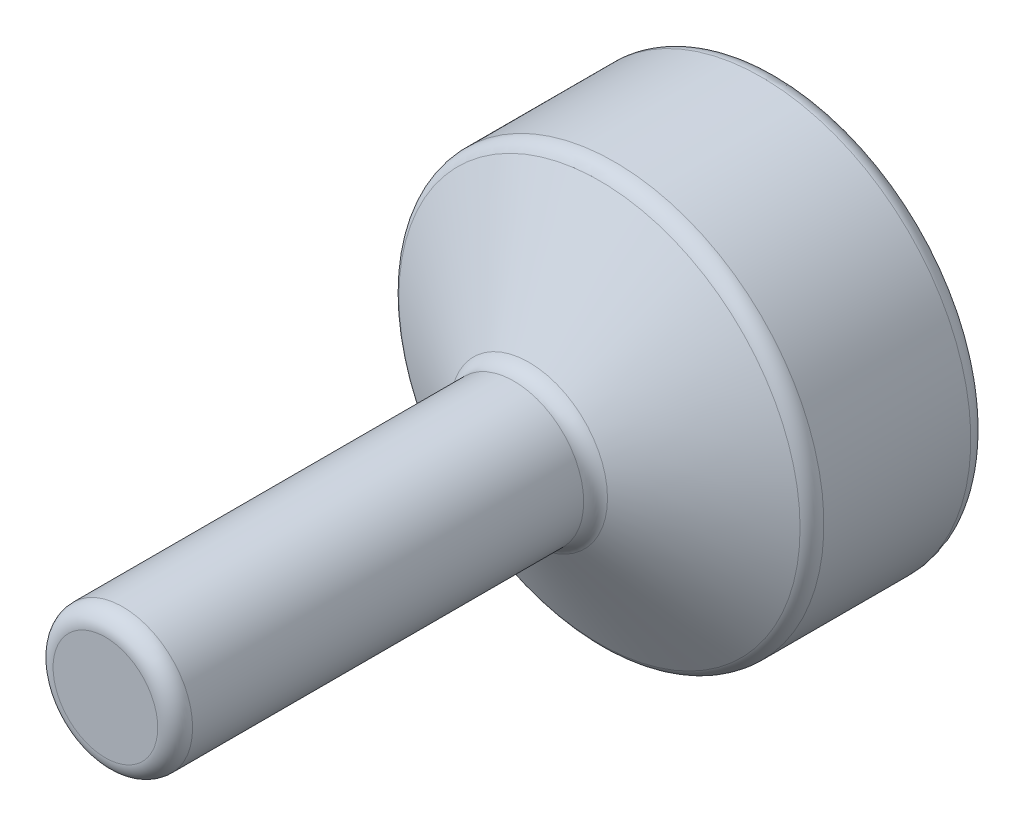
ISO-10303-21;
HEADER;
FILE_DESCRIPTION(('STEP AP214'),'2;1');
FILE_NAME('part.step','',(''),(''),'','','');
FILE_SCHEMA(('AUTOMOTIVE_DESIGN { 1 0 10303 214 1 1 1 1 }'));
ENDSEC;
DATA;
#1=APPLICATION_CONTEXT('core data for automotive mechanical design processes');
#2=APPLICATION_PROTOCOL_DEFINITION('international standard','automotive_design',2000,#1);
#3=PRODUCT_CONTEXT('',#1,'mechanical');
#4=PRODUCT('Part','Part','',(#3));
#5=PRODUCT_RELATED_PRODUCT_CATEGORY('part','',(#4));
#6=PRODUCT_DEFINITION_FORMATION('','',#4);
#7=PRODUCT_DEFINITION_CONTEXT('part definition',#1,'design');
#8=PRODUCT_DEFINITION('design','',#6,#7);
#9=PRODUCT_DEFINITION_SHAPE('','',#8);
#10=(LENGTH_UNIT() NAMED_UNIT(*) SI_UNIT(.MILLI.,.METRE.));
#11=(NAMED_UNIT(*) PLANE_ANGLE_UNIT() SI_UNIT($,.RADIAN.));
#12=(NAMED_UNIT(*) SI_UNIT($,.STERADIAN.) SOLID_ANGLE_UNIT());
#13=UNCERTAINTY_MEASURE_WITH_UNIT(LENGTH_MEASURE(1.E-05),#10,'distance_accuracy_value','');
#14=(GEOMETRIC_REPRESENTATION_CONTEXT(3) GLOBAL_UNCERTAINTY_ASSIGNED_CONTEXT((#13)) GLOBAL_UNIT_ASSIGNED_CONTEXT((#10,
#11,#12)) REPRESENTATION_CONTEXT('',''));
#15=CARTESIAN_POINT('',(0.,0.,0.));
#16=DIRECTION('',(0.,0.,1.));
#17=DIRECTION('',(1.,0.,0.));
#18=AXIS2_PLACEMENT_3D('',#15,#16,#17);
#19=CARTESIAN_POINT('',(0.,0.,0.));
#20=DIRECTION('',(0.,0.,-1.));
#21=DIRECTION('',(-1.,0.,0.));
#22=AXIS2_PLACEMENT_3D('',#19,#20,#21);
#23=PLANE('',#22);
#24=CARTESIAN_POINT('',(0.,0.,0.));
#25=DIRECTION('',(0.,0.,-1.));
#26=DIRECTION('',(-1.,0.,0.));
#27=AXIS2_PLACEMENT_3D('',#24,#25,#26);
#28=CIRCLE('',#27,2.794);
#29=CARTESIAN_POINT('',(-2.794,0.,0.));
#30=VERTEX_POINT('',#29);
#31=EDGE_CURVE('E10',#30,#30,#28,.T.);
#32=ORIENTED_EDGE('',*,*,#31,.T.);
#33=EDGE_LOOP('',(#32));
#34=FACE_BOUND('',#33,.T.);
#35=ADVANCED_FACE('F31',(#34),#23,.T.);
#36=CARTESIAN_POINT('',(0.,0.,9.80917574699331));
#37=DIRECTION('',(0.,0.,1.));
#38=DIRECTION('',(1.,0.,0.));
#39=AXIS2_PLACEMENT_3D('',#36,#37,#38);
#40=CYLINDRICAL_SURFACE('',#39,3.048);
#41=CARTESIAN_POINT('',(0.,0.,2.39335303162583));
#42=DIRECTION('',(0.,0.,-1.));
#43=DIRECTION('',(-1.,0.,0.));
#44=AXIS2_PLACEMENT_3D('',#41,#42,#43);
#45=CIRCLE('',#44,3.048);
#46=CARTESIAN_POINT('',(-3.048,0.,2.39335303162583));
#47=VERTEX_POINT('',#46);
#48=EDGE_CURVE('E42',#47,#47,#45,.T.);
#49=ORIENTED_EDGE('',*,*,#48,.T.);
#50=EDGE_LOOP('',(#49));
#51=FACE_BOUND('',#50,.T.);
#52=CARTESIAN_POINT('',(0.,0.,0.254000000000001));
#53=DIRECTION('',(0.,0.,-1.));
#54=DIRECTION('',(-1.,0.,0.));
#55=AXIS2_PLACEMENT_3D('',#52,#53,#54);
#56=CIRCLE('',#55,3.048);
#57=CARTESIAN_POINT('',(-3.048,0.,0.254000000000001));
#58=VERTEX_POINT('',#57);
#59=EDGE_CURVE('E46',#58,#58,#56,.F.);
#60=ORIENTED_EDGE('',*,*,#59,.T.);
#61=EDGE_LOOP('',(#60));
#62=FACE_BOUND('',#61,.T.);
#63=ADVANCED_FACE('F79',(#51,#62),#40,.T.);
#64=CARTESIAN_POINT('',(0.,0.,3.71317574699331));
#65=DIRECTION('',(0.,0.,-1.));
#66=DIRECTION('',(-1.,0.,0.));
#67=AXIS2_PLACEMENT_3D('',#64,#65,#66);
#68=CONICAL_SURFACE('',#67,1.016,1.0471975511966);
#69=CARTESIAN_POINT('',(0.,0.,3.63985226280623));
#70=DIRECTION('',(0.,0.,-1.));
#71=DIRECTION('',(-1.,0.,0.));
#72=AXIS2_PLACEMENT_3D('',#69,#70,#71);
#73=CIRCLE('',#72,1.143);
#74=CARTESIAN_POINT('',(-1.143,0.,3.63985226280623));
#75=VERTEX_POINT('',#74);
#76=EDGE_CURVE('E51',#75,#75,#73,.T.);
#77=ORIENTED_EDGE('',*,*,#76,.T.);
#78=EDGE_LOOP('',(#77));
#79=FACE_BOUND('',#78,.T.);
#80=CARTESIAN_POINT('',(0.,0.,2.61332348418708));
#81=DIRECTION('',(0.,0.,1.));
#82=DIRECTION('',(1.,0.,0.));
#83=AXIS2_PLACEMENT_3D('',#80,#81,#82);
#84=CIRCLE('',#83,2.921);
#85=CARTESIAN_POINT('',(2.921,0.,2.61332348418708));
#86=VERTEX_POINT('',#85);
#87=EDGE_CURVE('E54',#86,#86,#84,.T.);
#88=ORIENTED_EDGE('',*,*,#87,.T.);
#89=EDGE_LOOP('',(#88));
#90=FACE_BOUND('',#89,.T.);
#91=ADVANCED_FACE('F84',(#79,#90),#68,.T.);
#92=CARTESIAN_POINT('',(0.,0.,9.80917574699331));
#93=DIRECTION('',(0.,0.,1.));
#94=DIRECTION('',(1.,0.,0.));
#95=AXIS2_PLACEMENT_3D('',#92,#93,#94);
#96=CYLINDRICAL_SURFACE('',#95,1.016);
#97=CARTESIAN_POINT('',(0.,0.,3.85982271536748));
#98=DIRECTION('',(0.,0.,1.));
#99=DIRECTION('',(1.,0.,0.));
#100=AXIS2_PLACEMENT_3D('',#97,#98,#99);
#101=CIRCLE('',#100,1.016);
#102=CARTESIAN_POINT('',(1.016,0.,3.85982271536748));
#103=VERTEX_POINT('',#102);
#104=EDGE_CURVE('E57',#103,#103,#101,.T.);
#105=ORIENTED_EDGE('',*,*,#104,.T.);
#106=EDGE_LOOP('',(#105));
#107=FACE_BOUND('',#106,.T.);
#108=CARTESIAN_POINT('',(0.,0.,9.55517574699331));
#109=DIRECTION('',(0.,0.,1.));
#110=DIRECTION('',(1.,0.,0.));
#111=AXIS2_PLACEMENT_3D('',#108,#109,#110);
#112=CIRCLE('',#111,1.016);
#113=CARTESIAN_POINT('',(1.016,0.,9.55517574699331));
#114=VERTEX_POINT('',#113);
#115=EDGE_CURVE('E60',#114,#114,#112,.F.);
#116=ORIENTED_EDGE('',*,*,#115,.T.);
#117=EDGE_LOOP('',(#116));
#118=FACE_BOUND('',#117,.T.);
#119=ADVANCED_FACE('F64',(#107,#118),#96,.T.);
#120=CARTESIAN_POINT('',(1.016,0.,9.80917574699331));
#121=DIRECTION('',(0.,0.,1.));
#122=DIRECTION('',(1.,0.,0.));
#123=AXIS2_PLACEMENT_3D('',#120,#121,#122);
#124=PLANE('',#123);
#125=CARTESIAN_POINT('',(0.,0.,9.80917574699331));
#126=DIRECTION('',(0.,0.,1.));
#127=DIRECTION('',(1.,0.,0.));
#128=AXIS2_PLACEMENT_3D('',#125,#126,#127);
#129=CIRCLE('',#128,0.762);
#130=CARTESIAN_POINT('',(0.762,0.,9.80917574699331));
#131=VERTEX_POINT('',#130);
#132=EDGE_CURVE('E38',#131,#131,#129,.T.);
#133=ORIENTED_EDGE('',*,*,#132,.T.);
#134=EDGE_LOOP('',(#133));
#135=FACE_BOUND('',#134,.T.);
#136=ADVANCED_FACE('F90',(#135),#124,.T.);
#137=CARTESIAN_POINT('',(0.,0.,3.85982271536748));
#138=DIRECTION('',(0.,0.,1.));
#139=DIRECTION('',(1.,0.,0.));
#140=AXIS2_PLACEMENT_3D('',#137,#138,#139);
#141=TOROIDAL_SURFACE('',#140,1.27,0.254);
#142=ORIENTED_EDGE('',*,*,#76,.F.);
#143=EDGE_LOOP('',(#142));
#144=FACE_BOUND('',#143,.T.);
#145=ORIENTED_EDGE('',*,*,#104,.F.);
#146=EDGE_LOOP('',(#145));
#147=FACE_BOUND('',#146,.T.);
#148=ADVANCED_FACE('F75',(#144,#147),#141,.F.);
#149=CARTESIAN_POINT('',(0.,0.,2.39335303162583));
#150=DIRECTION('',(0.,0.,-1.));
#151=DIRECTION('',(-1.,0.,0.));
#152=AXIS2_PLACEMENT_3D('',#149,#150,#151);
#153=TOROIDAL_SURFACE('',#152,2.794,0.254);
#154=ORIENTED_EDGE('',*,*,#48,.F.);
#155=EDGE_LOOP('',(#154));
#156=FACE_BOUND('',#155,.T.);
#157=ORIENTED_EDGE('',*,*,#87,.F.);
#158=EDGE_LOOP('',(#157));
#159=FACE_BOUND('',#158,.T.);
#160=ADVANCED_FACE('F69',(#156,#159),#153,.T.);
#161=CARTESIAN_POINT('',(0.,0.,9.55517574699331));
#162=DIRECTION('',(0.,0.,1.));
#163=DIRECTION('',(1.,0.,0.));
#164=AXIS2_PLACEMENT_3D('',#161,#162,#163);
#165=TOROIDAL_SURFACE('',#164,0.762,0.254);
#166=ORIENTED_EDGE('',*,*,#115,.F.);
#167=EDGE_LOOP('',(#166));
#168=FACE_BOUND('',#167,.T.);
#169=ORIENTED_EDGE('',*,*,#132,.F.);
#170=EDGE_LOOP('',(#169));
#171=FACE_BOUND('',#170,.T.);
#172=ADVANCED_FACE('F66',(#168,#171),#165,.T.);
#173=CARTESIAN_POINT('',(0.,0.,0.254000000000001));
#174=DIRECTION('',(0.,0.,-1.));
#175=DIRECTION('',(-1.,0.,0.));
#176=AXIS2_PLACEMENT_3D('',#173,#174,#175);
#177=TOROIDAL_SURFACE('',#176,2.794,0.254);
#178=ORIENTED_EDGE('',*,*,#31,.F.);
#179=EDGE_LOOP('',(#178));
#180=FACE_BOUND('',#179,.T.);
#181=ORIENTED_EDGE('',*,*,#59,.F.);
#182=EDGE_LOOP('',(#181));
#183=FACE_BOUND('',#182,.T.);
#184=ADVANCED_FACE('F33',(#180,#183),#177,.T.);
#185=CLOSED_SHELL('',(#35,#63,#91,#119,#136,#148,#160,#172,#184));
#186=MANIFOLD_SOLID_BREP('B2',#185);
#187=ADVANCED_BREP_SHAPE_REPRESENTATION('',(#18,#186),#14);
#188=SHAPE_DEFINITION_REPRESENTATION(#9,#187);
ENDSEC;
END-ISO-10303-21;
